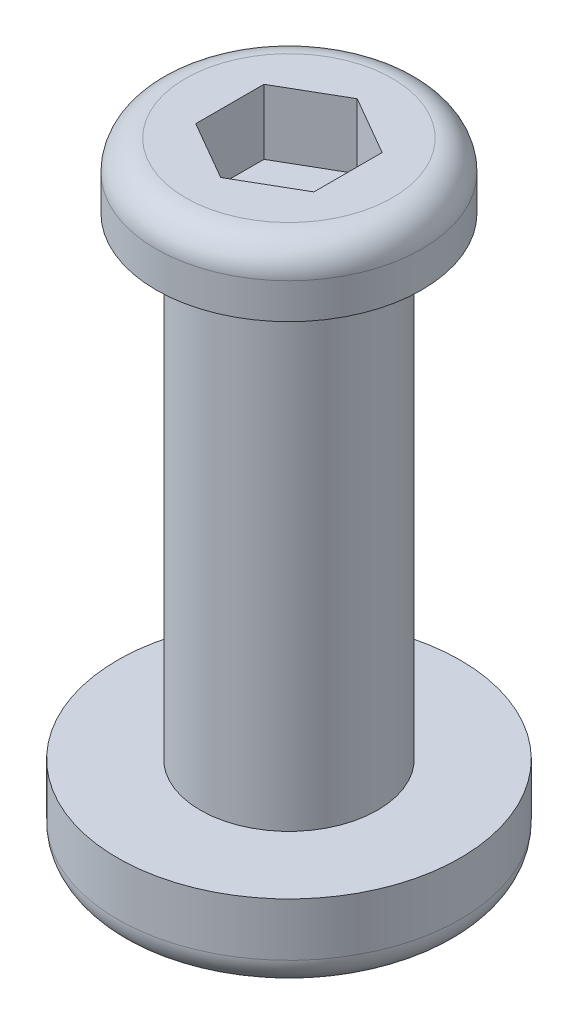
ISO-10303-21;
HEADER;
FILE_DESCRIPTION(('STEP AP214'),'2;1');
FILE_NAME('part.step','',(''),(''),'','','');
FILE_SCHEMA(('AUTOMOTIVE_DESIGN { 1 0 10303 214 1 1 1 1 }'));
ENDSEC;
DATA;
#1=APPLICATION_CONTEXT('core data for automotive mechanical design processes');
#2=APPLICATION_PROTOCOL_DEFINITION('international standard','automotive_design',2000,#1);
#3=PRODUCT_CONTEXT('',#1,'mechanical');
#4=PRODUCT('Part','Part','',(#3));
#5=PRODUCT_RELATED_PRODUCT_CATEGORY('part','',(#4));
#6=PRODUCT_DEFINITION_FORMATION('','',#4);
#7=PRODUCT_DEFINITION_CONTEXT('part definition',#1,'design');
#8=PRODUCT_DEFINITION('design','',#6,#7);
#9=PRODUCT_DEFINITION_SHAPE('','',#8);
#10=(LENGTH_UNIT() NAMED_UNIT(*) SI_UNIT(.MILLI.,.METRE.));
#11=(NAMED_UNIT(*) PLANE_ANGLE_UNIT() SI_UNIT($,.RADIAN.));
#12=(NAMED_UNIT(*) SI_UNIT($,.STERADIAN.) SOLID_ANGLE_UNIT());
#13=UNCERTAINTY_MEASURE_WITH_UNIT(LENGTH_MEASURE(1.E-05),#10,'distance_accuracy_value','');
#14=(GEOMETRIC_REPRESENTATION_CONTEXT(3) GLOBAL_UNCERTAINTY_ASSIGNED_CONTEXT((#13)) GLOBAL_UNIT_ASSIGNED_CONTEXT((#10,
#11,#12)) REPRESENTATION_CONTEXT('',''));
#15=CARTESIAN_POINT('',(0.,0.,0.));
#16=DIRECTION('',(0.,0.,1.));
#17=DIRECTION('',(1.,0.,0.));
#18=AXIS2_PLACEMENT_3D('',#15,#16,#17);
#19=CARTESIAN_POINT('',(0.,8.,0.));
#20=DIRECTION('',(0.,-1.,0.));
#21=DIRECTION('',(0.,0.,-1.));
#22=AXIS2_PLACEMENT_3D('',#19,#20,#21);
#23=CYLINDRICAL_SURFACE('',#22,1.5);
#24=CARTESIAN_POINT('',(0.,8.,0.));
#25=DIRECTION('',(0.,1.,0.));
#26=DIRECTION('',(0.,0.,1.));
#27=AXIS2_PLACEMENT_3D('',#24,#25,#26);
#28=CIRCLE('',#27,1.5);
#29=CARTESIAN_POINT('',(0.,8.,1.5));
#30=VERTEX_POINT('',#29);
#31=EDGE_CURVE('E236',#30,#30,#28,.T.);
#32=ORIENTED_EDGE('',*,*,#31,.F.);
#33=EDGE_LOOP('',(#32));
#34=FACE_BOUND('',#33,.T.);
#35=CARTESIAN_POINT('',(0.,0.,0.));
#36=DIRECTION('',(0.,-1.,0.));
#37=DIRECTION('',(0.,0.,-1.));
#38=AXIS2_PLACEMENT_3D('',#35,#36,#37);
#39=CIRCLE('',#38,1.5);
#40=CARTESIAN_POINT('',(0.,0.,-1.5));
#41=VERTEX_POINT('',#40);
#42=EDGE_CURVE('E188',#41,#41,#39,.T.);
#43=ORIENTED_EDGE('',*,*,#42,.F.);
#44=EDGE_LOOP('',(#43));
#45=FACE_BOUND('',#44,.T.);
#46=ADVANCED_FACE('F41',(#34,#45),#23,.T.);
#47=CARTESIAN_POINT('',(0.,9.1,0.));
#48=DIRECTION('',(0.,1.,0.));
#49=DIRECTION('',(0.,0.,1.));
#50=AXIS2_PLACEMENT_3D('',#47,#48,#49);
#51=PLANE('',#50);
#52=CARTESIAN_POINT('',(0.,9.1,0.));
#53=DIRECTION('',(0.,1.,0.));
#54=DIRECTION('',(0.,0.,1.));
#55=AXIS2_PLACEMENT_3D('',#52,#53,#54);
#56=CIRCLE('',#55,1.75);
#57=CARTESIAN_POINT('',(0.,9.1,1.75));
#58=VERTEX_POINT('',#57);
#59=EDGE_CURVE('E239',#58,#58,#56,.T.);
#60=ORIENTED_EDGE('',*,*,#59,.T.);
#61=EDGE_LOOP('',(#60));
#62=FACE_BOUND('',#61,.T.);
#63=DIRECTION('',(-0.866025403784438,0.,0.5));
#64=VECTOR('',#63,1.);
#65=CARTESIAN_POINT('',(0.,9.1,-1.15470053837925));
#66=LINE('',#65,#64);
#67=CARTESIAN_POINT('',(0.,9.1,-1.15470053837925));
#68=VERTEX_POINT('',#67);
#69=CARTESIAN_POINT('',(-1.,9.1,-0.577350269189626));
#70=VERTEX_POINT('',#69);
#71=EDGE_CURVE('E193',#68,#70,#66,.T.);
#72=ORIENTED_EDGE('',*,*,#71,.F.);
#73=DIRECTION('',(-0.866025403784439,0.,-0.5));
#74=VECTOR('',#73,1.);
#75=CARTESIAN_POINT('',(1.,9.1,-0.577350269189626));
#76=LINE('',#75,#74);
#77=CARTESIAN_POINT('',(1.,9.1,-0.577350269189626));
#78=VERTEX_POINT('',#77);
#79=EDGE_CURVE('E191',#78,#68,#76,.T.);
#80=ORIENTED_EDGE('',*,*,#79,.F.);
#81=DIRECTION('',(0.,0.,-1.));
#82=VECTOR('',#81,1.);
#83=CARTESIAN_POINT('',(1.,9.1,0.577350269189626));
#84=LINE('',#83,#82);
#85=CARTESIAN_POINT('',(1.,9.1,0.577350269189626));
#86=VERTEX_POINT('',#85);
#87=EDGE_CURVE('E203',#86,#78,#84,.T.);
#88=ORIENTED_EDGE('',*,*,#87,.F.);
#89=DIRECTION('',(0.866025403784439,0.,-0.5));
#90=VECTOR('',#89,1.);
#91=CARTESIAN_POINT('',(0.,9.1,1.15470053837925));
#92=LINE('',#91,#90);
#93=CARTESIAN_POINT('',(0.,9.1,1.15470053837925));
#94=VERTEX_POINT('',#93);
#95=EDGE_CURVE('E200',#94,#86,#92,.T.);
#96=ORIENTED_EDGE('',*,*,#95,.F.);
#97=DIRECTION('',(0.866025403784439,0.,0.5));
#98=VECTOR('',#97,1.);
#99=CARTESIAN_POINT('',(-1.,9.1,0.577350269189626));
#100=LINE('',#99,#98);
#101=CARTESIAN_POINT('',(-1.,9.1,0.577350269189626));
#102=VERTEX_POINT('',#101);
#103=EDGE_CURVE('E198',#102,#94,#100,.T.);
#104=ORIENTED_EDGE('',*,*,#103,.F.);
#105=DIRECTION('',(0.,0.,1.));
#106=VECTOR('',#105,1.);
#107=CARTESIAN_POINT('',(-1.,9.1,-0.577350269189626));
#108=LINE('',#107,#106);
#109=EDGE_CURVE('E196',#70,#102,#108,.T.);
#110=ORIENTED_EDGE('',*,*,#109,.F.);
#111=EDGE_LOOP('',(#72,#80,#88,#96,#104,#110));
#112=FACE_BOUND('',#111,.T.);
#113=ADVANCED_FACE('F258',(#62,#112),#51,.T.);
#114=CARTESIAN_POINT('',(0.,8.,0.));
#115=DIRECTION('',(0.,1.,0.));
#116=DIRECTION('',(0.,0.,1.));
#117=AXIS2_PLACEMENT_3D('',#114,#115,#116);
#118=PLANE('',#117);
#119=ORIENTED_EDGE('',*,*,#31,.T.);
#120=EDGE_LOOP('',(#119));
#121=FACE_BOUND('',#120,.T.);
#122=CARTESIAN_POINT('',(0.,8.,0.));
#123=DIRECTION('',(0.,1.,0.));
#124=DIRECTION('',(0.,0.,1.));
#125=AXIS2_PLACEMENT_3D('',#122,#123,#124);
#126=CIRCLE('',#125,2.25);
#127=CARTESIAN_POINT('',(0.,8.,2.25));
#128=VERTEX_POINT('',#127);
#129=EDGE_CURVE('E233',#128,#128,#126,.T.);
#130=ORIENTED_EDGE('',*,*,#129,.F.);
#131=EDGE_LOOP('',(#130));
#132=FACE_BOUND('',#131,.T.);
#133=ADVANCED_FACE('F265',(#121,#132),#118,.F.);
#134=CARTESIAN_POINT('',(0.,9.1,0.));
#135=DIRECTION('',(0.,-1.,0.));
#136=DIRECTION('',(0.,0.,-1.));
#137=AXIS2_PLACEMENT_3D('',#134,#135,#136);
#138=CYLINDRICAL_SURFACE('',#137,2.25);
#139=CARTESIAN_POINT('',(0.,8.6,0.));
#140=DIRECTION('',(0.,1.,0.));
#141=DIRECTION('',(0.,0.,1.));
#142=AXIS2_PLACEMENT_3D('',#139,#140,#141);
#143=CIRCLE('',#142,2.25);
#144=CARTESIAN_POINT('',(0.,8.6,2.25));
#145=VERTEX_POINT('',#144);
#146=EDGE_CURVE('E242',#145,#145,#143,.F.);
#147=ORIENTED_EDGE('',*,*,#146,.T.);
#148=EDGE_LOOP('',(#147));
#149=FACE_BOUND('',#148,.T.);
#150=ORIENTED_EDGE('',*,*,#129,.T.);
#151=EDGE_LOOP('',(#150));
#152=FACE_BOUND('',#151,.T.);
#153=ADVANCED_FACE('F279',(#149,#152),#138,.T.);
#154=CARTESIAN_POINT('',(1.,9.1,-0.577350269189626));
#155=DIRECTION('',(-0.5,0.,0.866025403784438));
#156=DIRECTION('',(0.866025403784439,0.,0.5));
#157=AXIS2_PLACEMENT_3D('',#154,#155,#156);
#158=PLANE('',#157);
#159=DIRECTION('',(-0.866025403784439,0.,-0.5));
#160=VECTOR('',#159,1.);
#161=CARTESIAN_POINT('',(1.,8.,-0.577350269189626));
#162=LINE('',#161,#160);
#163=CARTESIAN_POINT('',(1.,8.,-0.577350269189626));
#164=VERTEX_POINT('',#163);
#165=CARTESIAN_POINT('',(0.,8.,-1.15470053837925));
#166=VERTEX_POINT('',#165);
#167=EDGE_CURVE('E64',#164,#166,#162,.T.);
#168=ORIENTED_EDGE('',*,*,#167,.F.);
#169=DIRECTION('',(0.,-1.,0.));
#170=VECTOR('',#169,1.);
#171=CARTESIAN_POINT('',(1.,9.1,-0.577350269189626));
#172=LINE('',#171,#170);
#173=EDGE_CURVE('E205',#78,#164,#172,.T.);
#174=ORIENTED_EDGE('',*,*,#173,.F.);
#175=ORIENTED_EDGE('',*,*,#79,.T.);
#176=DIRECTION('',(0.,-1.,0.));
#177=VECTOR('',#176,1.);
#178=CARTESIAN_POINT('',(0.,9.1,-1.15470053837925));
#179=LINE('',#178,#177);
#180=EDGE_CURVE('E230',#68,#166,#179,.T.);
#181=ORIENTED_EDGE('',*,*,#180,.T.);
#182=EDGE_LOOP('',(#168,#174,#175,#181));
#183=FACE_BOUND('',#182,.T.);
#184=ADVANCED_FACE('F282',(#183),#158,.T.);
#185=CARTESIAN_POINT('',(0.,9.1,-1.15470053837925));
#186=DIRECTION('',(0.5,0.,0.866025403784439));
#187=DIRECTION('',(0.866025403784438,0.,-0.5));
#188=AXIS2_PLACEMENT_3D('',#185,#186,#187);
#189=PLANE('',#188);
#190=DIRECTION('',(-0.866025403784438,0.,0.5));
#191=VECTOR('',#190,1.);
#192=CARTESIAN_POINT('',(0.,8.,-1.15470053837925));
#193=LINE('',#192,#191);
#194=CARTESIAN_POINT('',(-1.,8.,-0.577350269189626));
#195=VERTEX_POINT('',#194);
#196=EDGE_CURVE('E207',#166,#195,#193,.T.);
#197=ORIENTED_EDGE('',*,*,#196,.F.);
#198=ORIENTED_EDGE('',*,*,#180,.F.);
#199=ORIENTED_EDGE('',*,*,#71,.T.);
#200=DIRECTION('',(0.,-1.,0.));
#201=VECTOR('',#200,1.);
#202=CARTESIAN_POINT('',(-1.,9.1,-0.577350269189626));
#203=LINE('',#202,#201);
#204=EDGE_CURVE('E227',#70,#195,#203,.T.);
#205=ORIENTED_EDGE('',*,*,#204,.T.);
#206=EDGE_LOOP('',(#197,#198,#199,#205));
#207=FACE_BOUND('',#206,.T.);
#208=ADVANCED_FACE('F288',(#207),#189,.T.);
#209=CARTESIAN_POINT('',(-1.,9.1,-0.577350269189626));
#210=DIRECTION('',(1.,0.,0.));
#211=DIRECTION('',(0.,0.,-1.));
#212=AXIS2_PLACEMENT_3D('',#209,#210,#211);
#213=PLANE('',#212);
#214=DIRECTION('',(0.,0.,1.));
#215=VECTOR('',#214,1.);
#216=CARTESIAN_POINT('',(-1.,8.,-0.577350269189626));
#217=LINE('',#216,#215);
#218=CARTESIAN_POINT('',(-1.,8.,0.577350269189626));
#219=VERTEX_POINT('',#218);
#220=EDGE_CURVE('E209',#195,#219,#217,.T.);
#221=ORIENTED_EDGE('',*,*,#220,.F.);
#222=ORIENTED_EDGE('',*,*,#204,.F.);
#223=ORIENTED_EDGE('',*,*,#109,.T.);
#224=DIRECTION('',(0.,-1.,0.));
#225=VECTOR('',#224,1.);
#226=CARTESIAN_POINT('',(-1.,9.1,0.577350269189626));
#227=LINE('',#226,#225);
#228=EDGE_CURVE('E224',#102,#219,#227,.T.);
#229=ORIENTED_EDGE('',*,*,#228,.T.);
#230=EDGE_LOOP('',(#221,#222,#223,#229));
#231=FACE_BOUND('',#230,.T.);
#232=ADVANCED_FACE('F292',(#231),#213,.T.);
#233=CARTESIAN_POINT('',(-1.,9.1,0.577350269189626));
#234=DIRECTION('',(0.5,0.,-0.866025403784438));
#235=DIRECTION('',(-0.866025403784439,0.,-0.5));
#236=AXIS2_PLACEMENT_3D('',#233,#234,#235);
#237=PLANE('',#236);
#238=DIRECTION('',(0.866025403784439,0.,0.5));
#239=VECTOR('',#238,1.);
#240=CARTESIAN_POINT('',(-1.,8.,0.577350269189626));
#241=LINE('',#240,#239);
#242=CARTESIAN_POINT('',(0.,8.,1.15470053837925));
#243=VERTEX_POINT('',#242);
#244=EDGE_CURVE('E211',#219,#243,#241,.T.);
#245=ORIENTED_EDGE('',*,*,#244,.F.);
#246=ORIENTED_EDGE('',*,*,#228,.F.);
#247=ORIENTED_EDGE('',*,*,#103,.T.);
#248=DIRECTION('',(0.,-1.,0.));
#249=VECTOR('',#248,1.);
#250=CARTESIAN_POINT('',(0.,9.1,1.15470053837925));
#251=LINE('',#250,#249);
#252=EDGE_CURVE('E221',#94,#243,#251,.T.);
#253=ORIENTED_EDGE('',*,*,#252,.T.);
#254=EDGE_LOOP('',(#245,#246,#247,#253));
#255=FACE_BOUND('',#254,.T.);
#256=ADVANCED_FACE('F296',(#255),#237,.T.);
#257=CARTESIAN_POINT('',(0.,9.1,1.15470053837925));
#258=DIRECTION('',(-0.5,0.,-0.866025403784439));
#259=DIRECTION('',(-0.866025403784439,0.,0.5));
#260=AXIS2_PLACEMENT_3D('',#257,#258,#259);
#261=PLANE('',#260);
#262=DIRECTION('',(0.866025403784439,0.,-0.5));
#263=VECTOR('',#262,1.);
#264=CARTESIAN_POINT('',(0.,8.,1.15470053837925));
#265=LINE('',#264,#263);
#266=CARTESIAN_POINT('',(1.,8.,0.577350269189626));
#267=VERTEX_POINT('',#266);
#268=EDGE_CURVE('E213',#243,#267,#265,.T.);
#269=ORIENTED_EDGE('',*,*,#268,.F.);
#270=ORIENTED_EDGE('',*,*,#252,.F.);
#271=ORIENTED_EDGE('',*,*,#95,.T.);
#272=DIRECTION('',(0.,-1.,0.));
#273=VECTOR('',#272,1.);
#274=CARTESIAN_POINT('',(1.,9.1,0.577350269189626));
#275=LINE('',#274,#273);
#276=EDGE_CURVE('E218',#86,#267,#275,.T.);
#277=ORIENTED_EDGE('',*,*,#276,.T.);
#278=EDGE_LOOP('',(#269,#270,#271,#277));
#279=FACE_BOUND('',#278,.T.);
#280=ADVANCED_FACE('F300',(#279),#261,.T.);
#281=CARTESIAN_POINT('',(1.,9.1,0.577350269189626));
#282=DIRECTION('',(-1.,0.,0.));
#283=DIRECTION('',(0.,0.,1.));
#284=AXIS2_PLACEMENT_3D('',#281,#282,#283);
#285=PLANE('',#284);
#286=DIRECTION('',(0.,0.,-1.));
#287=VECTOR('',#286,1.);
#288=CARTESIAN_POINT('',(1.,8.,0.577350269189626));
#289=LINE('',#288,#287);
#290=EDGE_CURVE('E194',#267,#164,#289,.T.);
#291=ORIENTED_EDGE('',*,*,#290,.F.);
#292=ORIENTED_EDGE('',*,*,#276,.F.);
#293=ORIENTED_EDGE('',*,*,#87,.T.);
#294=ORIENTED_EDGE('',*,*,#173,.T.);
#295=EDGE_LOOP('',(#291,#292,#293,#294));
#296=FACE_BOUND('',#295,.T.);
#297=ADVANCED_FACE('F278',(#296),#285,.T.);
#298=CARTESIAN_POINT('',(0.,8.,0.));
#299=DIRECTION('',(0.,1.,0.));
#300=DIRECTION('',(0.,0.,1.));
#301=AXIS2_PLACEMENT_3D('',#298,#299,#300);
#302=PLANE('',#301);
#303=ORIENTED_EDGE('',*,*,#167,.T.);
#304=ORIENTED_EDGE('',*,*,#196,.T.);
#305=ORIENTED_EDGE('',*,*,#220,.T.);
#306=ORIENTED_EDGE('',*,*,#244,.T.);
#307=ORIENTED_EDGE('',*,*,#268,.T.);
#308=ORIENTED_EDGE('',*,*,#290,.T.);
#309=EDGE_LOOP('',(#303,#304,#305,#306,#307,#308));
#310=FACE_BOUND('',#309,.T.);
#311=ADVANCED_FACE('F275',(#310),#302,.T.);
#312=CARTESIAN_POINT('',(0.,-1.4,0.));
#313=DIRECTION('',(0.,-1.,0.));
#314=DIRECTION('',(0.,0.,-1.));
#315=AXIS2_PLACEMENT_3D('',#312,#313,#314);
#316=PLANE('',#315);
#317=CARTESIAN_POINT('',(0.,-1.4,0.));
#318=DIRECTION('',(0.,-1.,0.));
#319=DIRECTION('',(0.,0.,-1.));
#320=AXIS2_PLACEMENT_3D('',#317,#318,#319);
#321=CIRCLE('',#320,2.4);
#322=CARTESIAN_POINT('',(0.,-1.4,-2.4));
#323=VERTEX_POINT('',#322);
#324=EDGE_CURVE('E49',#323,#323,#321,.T.);
#325=ORIENTED_EDGE('',*,*,#324,.T.);
#326=EDGE_LOOP('',(#325));
#327=FACE_BOUND('',#326,.T.);
#328=DIRECTION('',(-0.866025403784439,0.,-0.5));
#329=VECTOR('',#328,1.);
#330=CARTESIAN_POINT('',(0.,-1.4,1.15470053837925));
#331=LINE('',#330,#329);
#332=CARTESIAN_POINT('',(0.,-1.4,1.15470053837925));
#333=VERTEX_POINT('',#332);
#334=CARTESIAN_POINT('',(-1.,-1.4,0.577350269189626));
#335=VERTEX_POINT('',#334);
#336=EDGE_CURVE('E139',#333,#335,#331,.T.);
#337=ORIENTED_EDGE('',*,*,#336,.F.);
#338=DIRECTION('',(-0.866025403784439,0.,0.5));
#339=VECTOR('',#338,1.);
#340=CARTESIAN_POINT('',(1.,-1.4,0.577350269189627));
#341=LINE('',#340,#339);
#342=CARTESIAN_POINT('',(1.,-1.4,0.577350269189627));
#343=VERTEX_POINT('',#342);
#344=EDGE_CURVE('E131',#343,#333,#341,.T.);
#345=ORIENTED_EDGE('',*,*,#344,.F.);
#346=DIRECTION('',(0.,0.,1.));
#347=VECTOR('',#346,1.);
#348=CARTESIAN_POINT('',(1.,-1.4,-0.577350269189626));
#349=LINE('',#348,#347);
#350=CARTESIAN_POINT('',(1.,-1.4,-0.577350269189626));
#351=VERTEX_POINT('',#350);
#352=EDGE_CURVE('E162',#351,#343,#349,.T.);
#353=ORIENTED_EDGE('',*,*,#352,.F.);
#354=DIRECTION('',(0.866025403784439,0.,0.5));
#355=VECTOR('',#354,1.);
#356=CARTESIAN_POINT('',(0.,-1.4,-1.15470053837925));
#357=LINE('',#356,#355);
#358=CARTESIAN_POINT('',(0.,-1.4,-1.15470053837925));
#359=VERTEX_POINT('',#358);
#360=EDGE_CURVE('E159',#359,#351,#357,.T.);
#361=ORIENTED_EDGE('',*,*,#360,.F.);
#362=DIRECTION('',(0.866025403784439,0.,-0.5));
#363=VECTOR('',#362,1.);
#364=CARTESIAN_POINT('',(-1.,-1.4,-0.577350269189626));
#365=LINE('',#364,#363);
#366=CARTESIAN_POINT('',(-1.,-1.4,-0.577350269189626));
#367=VERTEX_POINT('',#366);
#368=EDGE_CURVE('E155',#367,#359,#365,.T.);
#369=ORIENTED_EDGE('',*,*,#368,.F.);
#370=DIRECTION('',(0.,0.,-1.));
#371=VECTOR('',#370,1.);
#372=CARTESIAN_POINT('',(-1.,-1.4,0.577350269189626));
#373=LINE('',#372,#371);
#374=EDGE_CURVE('E153',#335,#367,#373,.T.);
#375=ORIENTED_EDGE('',*,*,#374,.F.);
#376=EDGE_LOOP('',(#337,#345,#353,#361,#369,#375));
#377=FACE_BOUND('',#376,.T.);
#378=ADVANCED_FACE('F151',(#327,#377),#316,.T.);
#379=CARTESIAN_POINT('',(0.,0.,0.));
#380=DIRECTION('',(0.,-1.,0.));
#381=DIRECTION('',(0.,0.,-1.));
#382=AXIS2_PLACEMENT_3D('',#379,#380,#381);
#383=PLANE('',#382);
#384=ORIENTED_EDGE('',*,*,#42,.T.);
#385=EDGE_LOOP('',(#384));
#386=FACE_BOUND('',#385,.T.);
#387=CARTESIAN_POINT('',(0.,0.,0.));
#388=DIRECTION('',(0.,-1.,0.));
#389=DIRECTION('',(0.,0.,-1.));
#390=AXIS2_PLACEMENT_3D('',#387,#388,#389);
#391=CIRCLE('',#390,2.9);
#392=CARTESIAN_POINT('',(0.,0.,-2.9));
#393=VERTEX_POINT('',#392);
#394=EDGE_CURVE('E147',#393,#393,#391,.T.);
#395=ORIENTED_EDGE('',*,*,#394,.F.);
#396=EDGE_LOOP('',(#395));
#397=FACE_BOUND('',#396,.T.);
#398=ADVANCED_FACE('F311',(#386,#397),#383,.F.);
#399=CARTESIAN_POINT('',(0.,-1.4,0.));
#400=DIRECTION('',(0.,1.,0.));
#401=DIRECTION('',(0.,0.,1.));
#402=AXIS2_PLACEMENT_3D('',#399,#400,#401);
#403=CYLINDRICAL_SURFACE('',#402,2.9);
#404=CARTESIAN_POINT('',(0.,-0.9,0.));
#405=DIRECTION('',(0.,-1.,0.));
#406=DIRECTION('',(0.,0.,-1.));
#407=AXIS2_PLACEMENT_3D('',#404,#405,#406);
#408=CIRCLE('',#407,2.9);
#409=CARTESIAN_POINT('',(0.,-0.9,-2.9));
#410=VERTEX_POINT('',#409);
#411=EDGE_CURVE('E11',#410,#410,#408,.F.);
#412=ORIENTED_EDGE('',*,*,#411,.T.);
#413=EDGE_LOOP('',(#412));
#414=FACE_BOUND('',#413,.T.);
#415=ORIENTED_EDGE('',*,*,#394,.T.);
#416=EDGE_LOOP('',(#415));
#417=FACE_BOUND('',#416,.T.);
#418=ADVANCED_FACE('F308',(#414,#417),#403,.T.);
#419=CARTESIAN_POINT('',(1.,-1.4,0.577350269189627));
#420=DIRECTION('',(-0.5,0.,-0.866025403784439));
#421=DIRECTION('',(-0.866025403784439,0.,0.5));
#422=AXIS2_PLACEMENT_3D('',#419,#420,#421);
#423=PLANE('',#422);
#424=DIRECTION('',(-0.866025403784439,0.,0.5));
#425=VECTOR('',#424,1.);
#426=CARTESIAN_POINT('',(1.,0.,0.577350269189627));
#427=LINE('',#426,#425);
#428=CARTESIAN_POINT('',(1.,0.,0.577350269189627));
#429=VERTEX_POINT('',#428);
#430=CARTESIAN_POINT('',(0.,0.,1.15470053837925));
#431=VERTEX_POINT('',#430);
#432=EDGE_CURVE('E164',#429,#431,#427,.T.);
#433=ORIENTED_EDGE('',*,*,#432,.F.);
#434=DIRECTION('',(0.,1.,0.));
#435=VECTOR('',#434,1.);
#436=CARTESIAN_POINT('',(1.,-1.4,0.577350269189627));
#437=LINE('',#436,#435);
#438=EDGE_CURVE('E56',#343,#429,#437,.T.);
#439=ORIENTED_EDGE('',*,*,#438,.F.);
#440=ORIENTED_EDGE('',*,*,#344,.T.);
#441=DIRECTION('',(0.,1.,0.));
#442=VECTOR('',#441,1.);
#443=CARTESIAN_POINT('',(0.,-1.4,1.15470053837925));
#444=LINE('',#443,#442);
#445=EDGE_CURVE('E134',#333,#431,#444,.T.);
#446=ORIENTED_EDGE('',*,*,#445,.T.);
#447=EDGE_LOOP('',(#433,#439,#440,#446));
#448=FACE_BOUND('',#447,.T.);
#449=ADVANCED_FACE('F133',(#448),#423,.T.);
#450=CARTESIAN_POINT('',(0.,-1.4,1.15470053837925));
#451=DIRECTION('',(0.5,0.,-0.866025403784439));
#452=DIRECTION('',(-0.866025403784439,0.,-0.5));
#453=AXIS2_PLACEMENT_3D('',#450,#451,#452);
#454=PLANE('',#453);
#455=DIRECTION('',(-0.866025403784439,0.,-0.5));
#456=VECTOR('',#455,1.);
#457=CARTESIAN_POINT('',(0.,0.,1.15470053837925));
#458=LINE('',#457,#456);
#459=CARTESIAN_POINT('',(-1.,0.,0.577350269189626));
#460=VERTEX_POINT('',#459);
#461=EDGE_CURVE('E146',#431,#460,#458,.T.);
#462=ORIENTED_EDGE('',*,*,#461,.F.);
#463=ORIENTED_EDGE('',*,*,#445,.F.);
#464=ORIENTED_EDGE('',*,*,#336,.T.);
#465=DIRECTION('',(0.,1.,0.));
#466=VECTOR('',#465,1.);
#467=CARTESIAN_POINT('',(-1.,-1.4,0.577350269189626));
#468=LINE('',#467,#466);
#469=EDGE_CURVE('E148',#335,#460,#468,.T.);
#470=ORIENTED_EDGE('',*,*,#469,.T.);
#471=EDGE_LOOP('',(#462,#463,#464,#470));
#472=FACE_BOUND('',#471,.T.);
#473=ADVANCED_FACE('F143',(#472),#454,.T.);
#474=CARTESIAN_POINT('',(-1.,-1.4,0.577350269189626));
#475=DIRECTION('',(1.,0.,0.));
#476=DIRECTION('',(0.,0.,-1.));
#477=AXIS2_PLACEMENT_3D('',#474,#475,#476);
#478=PLANE('',#477);
#479=DIRECTION('',(0.,0.,-1.));
#480=VECTOR('',#479,1.);
#481=CARTESIAN_POINT('',(-1.,0.,0.577350269189626));
#482=LINE('',#481,#480);
#483=CARTESIAN_POINT('',(-1.,0.,-0.577350269189626));
#484=VERTEX_POINT('',#483);
#485=EDGE_CURVE('E167',#460,#484,#482,.T.);
#486=ORIENTED_EDGE('',*,*,#485,.F.);
#487=ORIENTED_EDGE('',*,*,#469,.F.);
#488=ORIENTED_EDGE('',*,*,#374,.T.);
#489=DIRECTION('',(0.,1.,0.));
#490=VECTOR('',#489,1.);
#491=CARTESIAN_POINT('',(-1.,-1.4,-0.577350269189626));
#492=LINE('',#491,#490);
#493=EDGE_CURVE('E183',#367,#484,#492,.T.);
#494=ORIENTED_EDGE('',*,*,#493,.T.);
#495=EDGE_LOOP('',(#486,#487,#488,#494));
#496=FACE_BOUND('',#495,.T.);
#497=ADVANCED_FACE('F322',(#496),#478,.T.);
#498=CARTESIAN_POINT('',(-1.,-1.4,-0.577350269189626));
#499=DIRECTION('',(0.5,0.,0.866025403784439));
#500=DIRECTION('',(0.866025403784439,0.,-0.5));
#501=AXIS2_PLACEMENT_3D('',#498,#499,#500);
#502=PLANE('',#501);
#503=DIRECTION('',(0.866025403784439,0.,-0.5));
#504=VECTOR('',#503,1.);
#505=CARTESIAN_POINT('',(-1.,0.,-0.577350269189626));
#506=LINE('',#505,#504);
#507=CARTESIAN_POINT('',(0.,0.,-1.15470053837925));
#508=VERTEX_POINT('',#507);
#509=EDGE_CURVE('E170',#484,#508,#506,.T.);
#510=ORIENTED_EDGE('',*,*,#509,.F.);
#511=ORIENTED_EDGE('',*,*,#493,.F.);
#512=ORIENTED_EDGE('',*,*,#368,.T.);
#513=DIRECTION('',(0.,1.,0.));
#514=VECTOR('',#513,1.);
#515=CARTESIAN_POINT('',(0.,-1.4,-1.15470053837925));
#516=LINE('',#515,#514);
#517=EDGE_CURVE('E181',#359,#508,#516,.T.);
#518=ORIENTED_EDGE('',*,*,#517,.T.);
#519=EDGE_LOOP('',(#510,#511,#512,#518));
#520=FACE_BOUND('',#519,.T.);
#521=ADVANCED_FACE('F325',(#520),#502,.T.);
#522=CARTESIAN_POINT('',(0.,-1.4,-1.15470053837925));
#523=DIRECTION('',(-0.5,0.,0.866025403784439));
#524=DIRECTION('',(0.866025403784439,0.,0.5));
#525=AXIS2_PLACEMENT_3D('',#522,#523,#524);
#526=PLANE('',#525);
#527=DIRECTION('',(0.866025403784439,0.,0.5));
#528=VECTOR('',#527,1.);
#529=CARTESIAN_POINT('',(0.,0.,-1.15470053837925));
#530=LINE('',#529,#528);
#531=CARTESIAN_POINT('',(1.,0.,-0.577350269189626));
#532=VERTEX_POINT('',#531);
#533=EDGE_CURVE('E173',#508,#532,#530,.T.);
#534=ORIENTED_EDGE('',*,*,#533,.F.);
#535=ORIENTED_EDGE('',*,*,#517,.F.);
#536=ORIENTED_EDGE('',*,*,#360,.T.);
#537=DIRECTION('',(0.,1.,0.));
#538=VECTOR('',#537,1.);
#539=CARTESIAN_POINT('',(1.,-1.4,-0.577350269189626));
#540=LINE('',#539,#538);
#541=EDGE_CURVE('E179',#351,#532,#540,.T.);
#542=ORIENTED_EDGE('',*,*,#541,.T.);
#543=EDGE_LOOP('',(#534,#535,#536,#542));
#544=FACE_BOUND('',#543,.T.);
#545=ADVANCED_FACE('F329',(#544),#526,.T.);
#546=CARTESIAN_POINT('',(1.,-1.4,-0.577350269189626));
#547=DIRECTION('',(-1.,0.,0.));
#548=DIRECTION('',(0.,0.,1.));
#549=AXIS2_PLACEMENT_3D('',#546,#547,#548);
#550=PLANE('',#549);
#551=DIRECTION('',(0.,0.,1.));
#552=VECTOR('',#551,1.);
#553=CARTESIAN_POINT('',(1.,0.,-0.577350269189626));
#554=LINE('',#553,#552);
#555=EDGE_CURVE('E140',#532,#429,#554,.T.);
#556=ORIENTED_EDGE('',*,*,#555,.F.);
#557=ORIENTED_EDGE('',*,*,#541,.F.);
#558=ORIENTED_EDGE('',*,*,#352,.T.);
#559=ORIENTED_EDGE('',*,*,#438,.T.);
#560=EDGE_LOOP('',(#556,#557,#558,#559));
#561=FACE_BOUND('',#560,.T.);
#562=ADVANCED_FACE('F273',(#561),#550,.T.);
#563=CARTESIAN_POINT('',(0.,0.,0.));
#564=DIRECTION('',(0.,1.,0.));
#565=DIRECTION('',(0.,0.,1.));
#566=AXIS2_PLACEMENT_3D('',#563,#564,#565);
#567=PLANE('',#566);
#568=ORIENTED_EDGE('',*,*,#555,.T.);
#569=ORIENTED_EDGE('',*,*,#432,.T.);
#570=ORIENTED_EDGE('',*,*,#461,.T.);
#571=ORIENTED_EDGE('',*,*,#485,.T.);
#572=ORIENTED_EDGE('',*,*,#509,.T.);
#573=ORIENTED_EDGE('',*,*,#533,.T.);
#574=EDGE_LOOP('',(#568,#569,#570,#571,#572,#573));
#575=FACE_BOUND('',#574,.T.);
#576=ADVANCED_FACE('F254',(#575),#567,.F.);
#577=CARTESIAN_POINT('',(0.,8.6,0.));
#578=DIRECTION('',(0.,1.,0.));
#579=DIRECTION('',(0.,0.,1.));
#580=AXIS2_PLACEMENT_3D('',#577,#578,#579);
#581=TOROIDAL_SURFACE('',#580,1.75,0.5);
#582=ORIENTED_EDGE('',*,*,#146,.F.);
#583=EDGE_LOOP('',(#582));
#584=FACE_BOUND('',#583,.T.);
#585=ORIENTED_EDGE('',*,*,#59,.F.);
#586=EDGE_LOOP('',(#585));
#587=FACE_BOUND('',#586,.T.);
#588=ADVANCED_FACE('F249',(#584,#587),#581,.T.);
#589=CARTESIAN_POINT('',(0.,-0.9,0.));
#590=DIRECTION('',(0.,-1.,0.));
#591=DIRECTION('',(0.,0.,-1.));
#592=AXIS2_PLACEMENT_3D('',#589,#590,#591);
#593=TOROIDAL_SURFACE('',#592,2.4,0.5);
#594=ORIENTED_EDGE('',*,*,#411,.F.);
#595=EDGE_LOOP('',(#594));
#596=FACE_BOUND('',#595,.T.);
#597=ORIENTED_EDGE('',*,*,#324,.F.);
#598=EDGE_LOOP('',(#597));
#599=FACE_BOUND('',#598,.T.);
#600=ADVANCED_FACE('F43',(#596,#599),#593,.T.);
#601=CLOSED_SHELL('',(#46,#113,#133,#153,#184,#208,#232,#256,#280,#297,#311,#378,#398,#418,#449,
#473,#497,#521,#545,#562,#576,#588,#600));
#602=MANIFOLD_SOLID_BREP('B2',#601);
#603=ADVANCED_BREP_SHAPE_REPRESENTATION('',(#18,#602),#14);
#604=SHAPE_DEFINITION_REPRESENTATION(#9,#603);
ENDSEC;
END-ISO-10303-21;
